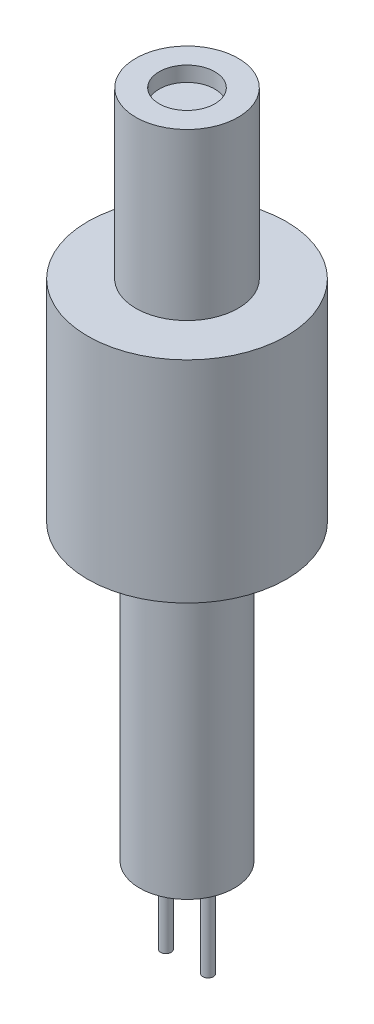
ISO-10303-21;
HEADER;
FILE_DESCRIPTION(('STEP AP214'),'2;1');
FILE_NAME('part.step','',(''),(''),'','','');
FILE_SCHEMA(('AUTOMOTIVE_DESIGN { 1 0 10303 214 1 1 1 1 }'));
ENDSEC;
DATA;
#1=APPLICATION_CONTEXT('core data for automotive mechanical design processes');
#2=APPLICATION_PROTOCOL_DEFINITION('international standard','automotive_design',2000,#1);
#3=PRODUCT_CONTEXT('',#1,'mechanical');
#4=PRODUCT('Part','Part','',(#3));
#5=PRODUCT_RELATED_PRODUCT_CATEGORY('part','',(#4));
#6=PRODUCT_DEFINITION_FORMATION('','',#4);
#7=PRODUCT_DEFINITION_CONTEXT('part definition',#1,'design');
#8=PRODUCT_DEFINITION('design','',#6,#7);
#9=PRODUCT_DEFINITION_SHAPE('','',#8);
#10=(LENGTH_UNIT() NAMED_UNIT(*) SI_UNIT(.MILLI.,.METRE.));
#11=(NAMED_UNIT(*) PLANE_ANGLE_UNIT() SI_UNIT($,.RADIAN.));
#12=(NAMED_UNIT(*) SI_UNIT($,.STERADIAN.) SOLID_ANGLE_UNIT());
#13=UNCERTAINTY_MEASURE_WITH_UNIT(LENGTH_MEASURE(1.E-05),#10,'distance_accuracy_value','');
#14=(GEOMETRIC_REPRESENTATION_CONTEXT(3) GLOBAL_UNCERTAINTY_ASSIGNED_CONTEXT((#13)) GLOBAL_UNIT_ASSIGNED_CONTEXT((#10,
#11,#12)) REPRESENTATION_CONTEXT('',''));
#15=CARTESIAN_POINT('',(0.,0.,0.));
#16=DIRECTION('',(0.,0.,1.));
#17=DIRECTION('',(1.,0.,0.));
#18=AXIS2_PLACEMENT_3D('',#15,#16,#17);
#19=CARTESIAN_POINT('',(0.,19.5,0.));
#20=DIRECTION('',(0.,-1.,0.));
#21=DIRECTION('',(0.,0.,-1.));
#22=AXIS2_PLACEMENT_3D('',#19,#20,#21);
#23=CYLINDRICAL_SURFACE('',#22,3.15);
#24=CARTESIAN_POINT('',(0.,19.5,0.));
#25=DIRECTION('',(0.,1.,0.));
#26=DIRECTION('',(0.,0.,1.));
#27=AXIS2_PLACEMENT_3D('',#24,#25,#26);
#28=CIRCLE('',#27,3.15);
#29=CARTESIAN_POINT('',(0.,19.5,3.15));
#30=VERTEX_POINT('',#29);
#31=EDGE_CURVE('E65',#30,#30,#28,.T.);
#32=ORIENTED_EDGE('',*,*,#31,.F.);
#33=EDGE_LOOP('',(#32));
#34=FACE_BOUND('',#33,.T.);
#35=CARTESIAN_POINT('',(0.,0.,0.));
#36=DIRECTION('',(0.,1.,0.));
#37=DIRECTION('',(0.,0.,1.));
#38=AXIS2_PLACEMENT_3D('',#35,#36,#37);
#39=CIRCLE('',#38,3.15);
#40=CARTESIAN_POINT('',(0.,0.,3.15));
#41=VERTEX_POINT('',#40);
#42=EDGE_CURVE('E64',#41,#41,#39,.T.);
#43=ORIENTED_EDGE('',*,*,#42,.T.);
#44=EDGE_LOOP('',(#43));
#45=FACE_BOUND('',#44,.T.);
#46=ADVANCED_FACE('F36',(#34,#45),#23,.T.);
#47=CARTESIAN_POINT('',(0.,0.,0.));
#48=DIRECTION('',(0.,1.,0.));
#49=DIRECTION('',(0.,0.,1.));
#50=AXIS2_PLACEMENT_3D('',#47,#48,#49);
#51=PLANE('',#50);
#52=CARTESIAN_POINT('',(1.4,0.,0.));
#53=DIRECTION('',(0.,1.,0.));
#54=DIRECTION('',(0.,0.,1.));
#55=AXIS2_PLACEMENT_3D('',#52,#53,#54);
#56=CIRCLE('',#55,0.35);
#57=CARTESIAN_POINT('',(1.4,0.,0.35));
#58=VERTEX_POINT('',#57);
#59=EDGE_CURVE('E39',#58,#58,#56,.F.);
#60=ORIENTED_EDGE('',*,*,#59,.F.);
#61=EDGE_LOOP('',(#60));
#62=FACE_BOUND('',#61,.T.);
#63=CARTESIAN_POINT('',(-1.4,0.,0.));
#64=DIRECTION('',(0.,1.,0.));
#65=DIRECTION('',(0.,0.,1.));
#66=AXIS2_PLACEMENT_3D('',#63,#64,#65);
#67=CIRCLE('',#66,0.35);
#68=CARTESIAN_POINT('',(-1.4,0.,0.35));
#69=VERTEX_POINT('',#68);
#70=EDGE_CURVE('E47',#69,#69,#67,.F.);
#71=ORIENTED_EDGE('',*,*,#70,.F.);
#72=EDGE_LOOP('',(#71));
#73=FACE_BOUND('',#72,.T.);
#74=ORIENTED_EDGE('',*,*,#42,.F.);
#75=EDGE_LOOP('',(#74));
#76=FACE_BOUND('',#75,.T.);
#77=ADVANCED_FACE('F74',(#62,#73,#76),#51,.F.);
#78=CARTESIAN_POINT('',(-1.4,-5.8,0.));
#79=DIRECTION('',(0.,1.,0.));
#80=DIRECTION('',(0.,0.,1.));
#81=AXIS2_PLACEMENT_3D('',#78,#79,#80);
#82=CYLINDRICAL_SURFACE('',#81,0.35);
#83=CARTESIAN_POINT('',(-1.4,-5.8,0.));
#84=DIRECTION('',(0.,-1.,0.));
#85=DIRECTION('',(0.,0.,-1.));
#86=AXIS2_PLACEMENT_3D('',#83,#84,#85);
#87=CIRCLE('',#86,0.35);
#88=CARTESIAN_POINT('',(-1.4,-5.8,-0.35));
#89=VERTEX_POINT('',#88);
#90=EDGE_CURVE('E61',#89,#89,#87,.T.);
#91=ORIENTED_EDGE('',*,*,#90,.F.);
#92=EDGE_LOOP('',(#91));
#93=FACE_BOUND('',#92,.T.);
#94=ORIENTED_EDGE('',*,*,#70,.T.);
#95=EDGE_LOOP('',(#94));
#96=FACE_BOUND('',#95,.T.);
#97=ADVANCED_FACE('F72',(#93,#96),#82,.T.);
#98=CARTESIAN_POINT('',(-1.4,-5.8,0.));
#99=DIRECTION('',(0.,-1.,0.));
#100=DIRECTION('',(0.,0.,-1.));
#101=AXIS2_PLACEMENT_3D('',#98,#99,#100);
#102=PLANE('',#101);
#103=ORIENTED_EDGE('',*,*,#90,.T.);
#104=EDGE_LOOP('',(#103));
#105=FACE_BOUND('',#104,.T.);
#106=ADVANCED_FACE('F112',(#105),#102,.T.);
#107=CARTESIAN_POINT('',(1.4,-5.8,0.));
#108=DIRECTION('',(0.,1.,0.));
#109=DIRECTION('',(0.,0.,1.));
#110=AXIS2_PLACEMENT_3D('',#107,#108,#109);
#111=CYLINDRICAL_SURFACE('',#110,0.35);
#112=CARTESIAN_POINT('',(1.4,-5.8,0.));
#113=DIRECTION('',(0.,-1.,0.));
#114=DIRECTION('',(0.,0.,-1.));
#115=AXIS2_PLACEMENT_3D('',#112,#113,#114);
#116=CIRCLE('',#115,0.35);
#117=CARTESIAN_POINT('',(1.4,-5.8,-0.35));
#118=VERTEX_POINT('',#117);
#119=EDGE_CURVE('E55',#118,#118,#116,.T.);
#120=ORIENTED_EDGE('',*,*,#119,.F.);
#121=EDGE_LOOP('',(#120));
#122=FACE_BOUND('',#121,.T.);
#123=ORIENTED_EDGE('',*,*,#59,.T.);
#124=EDGE_LOOP('',(#123));
#125=FACE_BOUND('',#124,.T.);
#126=ADVANCED_FACE('F105',(#122,#125),#111,.T.);
#127=CARTESIAN_POINT('',(1.4,-5.8,0.));
#128=DIRECTION('',(0.,-1.,0.));
#129=DIRECTION('',(0.,0.,-1.));
#130=AXIS2_PLACEMENT_3D('',#127,#128,#129);
#131=PLANE('',#130);
#132=ORIENTED_EDGE('',*,*,#119,.T.);
#133=EDGE_LOOP('',(#132));
#134=FACE_BOUND('',#133,.T.);
#135=ADVANCED_FACE('F96',(#134),#131,.T.);
#136=CARTESIAN_POINT('',(0.,33.5,0.));
#137=DIRECTION('',(0.,-1.,0.));
#138=DIRECTION('',(0.,0.,-1.));
#139=AXIS2_PLACEMENT_3D('',#136,#137,#138);
#140=CYLINDRICAL_SURFACE('',#139,6.6);
#141=CARTESIAN_POINT('',(0.,33.5,0.));
#142=DIRECTION('',(0.,1.,0.));
#143=DIRECTION('',(0.,0.,1.));
#144=AXIS2_PLACEMENT_3D('',#141,#142,#143);
#145=CIRCLE('',#144,6.6);
#146=CARTESIAN_POINT('',(0.,33.5,6.6));
#147=VERTEX_POINT('',#146);
#148=EDGE_CURVE('E52',#147,#147,#145,.T.);
#149=ORIENTED_EDGE('',*,*,#148,.F.);
#150=EDGE_LOOP('',(#149));
#151=FACE_BOUND('',#150,.T.);
#152=CARTESIAN_POINT('',(0.,19.5,0.));
#153=DIRECTION('',(0.,1.,0.));
#154=DIRECTION('',(0.,0.,1.));
#155=AXIS2_PLACEMENT_3D('',#152,#153,#154);
#156=CIRCLE('',#155,6.6);
#157=CARTESIAN_POINT('',(0.,19.5,6.6));
#158=VERTEX_POINT('',#157);
#159=EDGE_CURVE('E56',#158,#158,#156,.T.);
#160=ORIENTED_EDGE('',*,*,#159,.T.);
#161=EDGE_LOOP('',(#160));
#162=FACE_BOUND('',#161,.T.);
#163=ADVANCED_FACE('F94',(#151,#162),#140,.T.);
#164=CARTESIAN_POINT('',(0.,33.5,0.));
#165=DIRECTION('',(0.,1.,0.));
#166=DIRECTION('',(0.,0.,1.));
#167=AXIS2_PLACEMENT_3D('',#164,#165,#166);
#168=PLANE('',#167);
#169=CARTESIAN_POINT('',(0.,33.5,0.));
#170=DIRECTION('',(0.,1.,0.));
#171=DIRECTION('',(0.,0.,1.));
#172=AXIS2_PLACEMENT_3D('',#169,#170,#171);
#173=CIRCLE('',#172,3.4);
#174=CARTESIAN_POINT('',(0.,33.5,3.4));
#175=VERTEX_POINT('',#174);
#176=EDGE_CURVE('E10',#175,#175,#173,.T.);
#177=ORIENTED_EDGE('',*,*,#176,.F.);
#178=EDGE_LOOP('',(#177));
#179=FACE_BOUND('',#178,.T.);
#180=ORIENTED_EDGE('',*,*,#148,.T.);
#181=EDGE_LOOP('',(#180));
#182=FACE_BOUND('',#181,.T.);
#183=ADVANCED_FACE('F90',(#179,#182),#168,.T.);
#184=CARTESIAN_POINT('',(0.,19.5,0.));
#185=DIRECTION('',(0.,1.,0.));
#186=DIRECTION('',(0.,0.,1.));
#187=AXIS2_PLACEMENT_3D('',#184,#185,#186);
#188=PLANE('',#187);
#189=ORIENTED_EDGE('',*,*,#31,.T.);
#190=EDGE_LOOP('',(#189));
#191=FACE_BOUND('',#190,.T.);
#192=ORIENTED_EDGE('',*,*,#159,.F.);
#193=EDGE_LOOP('',(#192));
#194=FACE_BOUND('',#193,.T.);
#195=ADVANCED_FACE('F86',(#191,#194),#188,.F.);
#196=CARTESIAN_POINT('',(0.,44.5,0.));
#197=DIRECTION('',(0.,-1.,0.));
#198=DIRECTION('',(0.,0.,-1.));
#199=AXIS2_PLACEMENT_3D('',#196,#197,#198);
#200=CYLINDRICAL_SURFACE('',#199,3.4);
#201=CARTESIAN_POINT('',(0.,44.5,0.));
#202=DIRECTION('',(0.,1.,0.));
#203=DIRECTION('',(0.,0.,1.));
#204=AXIS2_PLACEMENT_3D('',#201,#202,#203);
#205=CIRCLE('',#204,3.4);
#206=CARTESIAN_POINT('',(0.,44.5,3.4));
#207=VERTEX_POINT('',#206);
#208=EDGE_CURVE('E50',#207,#207,#205,.T.);
#209=ORIENTED_EDGE('',*,*,#208,.F.);
#210=EDGE_LOOP('',(#209));
#211=FACE_BOUND('',#210,.T.);
#212=ORIENTED_EDGE('',*,*,#176,.T.);
#213=EDGE_LOOP('',(#212));
#214=FACE_BOUND('',#213,.T.);
#215=ADVANCED_FACE('F89',(#211,#214),#200,.T.);
#216=CARTESIAN_POINT('',(0.,44.5,0.));
#217=DIRECTION('',(0.,1.,0.));
#218=DIRECTION('',(0.,0.,1.));
#219=AXIS2_PLACEMENT_3D('',#216,#217,#218);
#220=PLANE('',#219);
#221=CARTESIAN_POINT('',(0.,44.5,0.));
#222=DIRECTION('',(0.,1.,0.));
#223=DIRECTION('',(0.,0.,1.));
#224=AXIS2_PLACEMENT_3D('',#221,#222,#223);
#225=CIRCLE('',#224,1.85);
#226=CARTESIAN_POINT('',(0.,44.5,1.85));
#227=VERTEX_POINT('',#226);
#228=EDGE_CURVE('E198',#227,#227,#225,.T.);
#229=ORIENTED_EDGE('',*,*,#228,.F.);
#230=EDGE_LOOP('',(#229));
#231=FACE_BOUND('',#230,.T.);
#232=ORIENTED_EDGE('',*,*,#208,.T.);
#233=EDGE_LOOP('',(#232));
#234=FACE_BOUND('',#233,.T.);
#235=ADVANCED_FACE('F161',(#231,#234),#220,.T.);
#236=CARTESIAN_POINT('',(0.,43.5,0.));
#237=DIRECTION('',(0.,1.,0.));
#238=DIRECTION('',(0.,0.,1.));
#239=AXIS2_PLACEMENT_3D('',#236,#237,#238);
#240=CYLINDRICAL_SURFACE('',#239,1.85);
#241=CARTESIAN_POINT('',(0.,43.5,0.));
#242=DIRECTION('',(0.,1.,0.));
#243=DIRECTION('',(0.,0.,1.));
#244=AXIS2_PLACEMENT_3D('',#241,#242,#243);
#245=CIRCLE('',#244,1.85);
#246=CARTESIAN_POINT('',(0.,43.5,1.85));
#247=VERTEX_POINT('',#246);
#248=EDGE_CURVE('E197',#247,#247,#245,.T.);
#249=ORIENTED_EDGE('',*,*,#248,.F.);
#250=EDGE_LOOP('',(#249));
#251=FACE_BOUND('',#250,.T.);
#252=ORIENTED_EDGE('',*,*,#228,.T.);
#253=EDGE_LOOP('',(#252));
#254=FACE_BOUND('',#253,.T.);
#255=ADVANCED_FACE('F171',(#251,#254),#240,.F.);
#256=CARTESIAN_POINT('',(0.,43.5,0.));
#257=DIRECTION('',(0.,1.,0.));
#258=DIRECTION('',(0.,0.,1.));
#259=AXIS2_PLACEMENT_3D('',#256,#257,#258);
#260=PLANE('',#259);
#261=ORIENTED_EDGE('',*,*,#248,.T.);
#262=EDGE_LOOP('',(#261));
#263=FACE_BOUND('',#262,.T.);
#264=ADVANCED_FACE('F181',(#263),#260,.T.);
#265=CLOSED_SHELL('',(#46,#77,#97,#106,#126,#135,#163,#183,#195,#215,#235,#255,#264));
#266=MANIFOLD_SOLID_BREP('B2',#265);
#267=ADVANCED_BREP_SHAPE_REPRESENTATION('',(#18,#266),#14);
#268=SHAPE_DEFINITION_REPRESENTATION(#9,#267);
ENDSEC;
END-ISO-10303-21;
